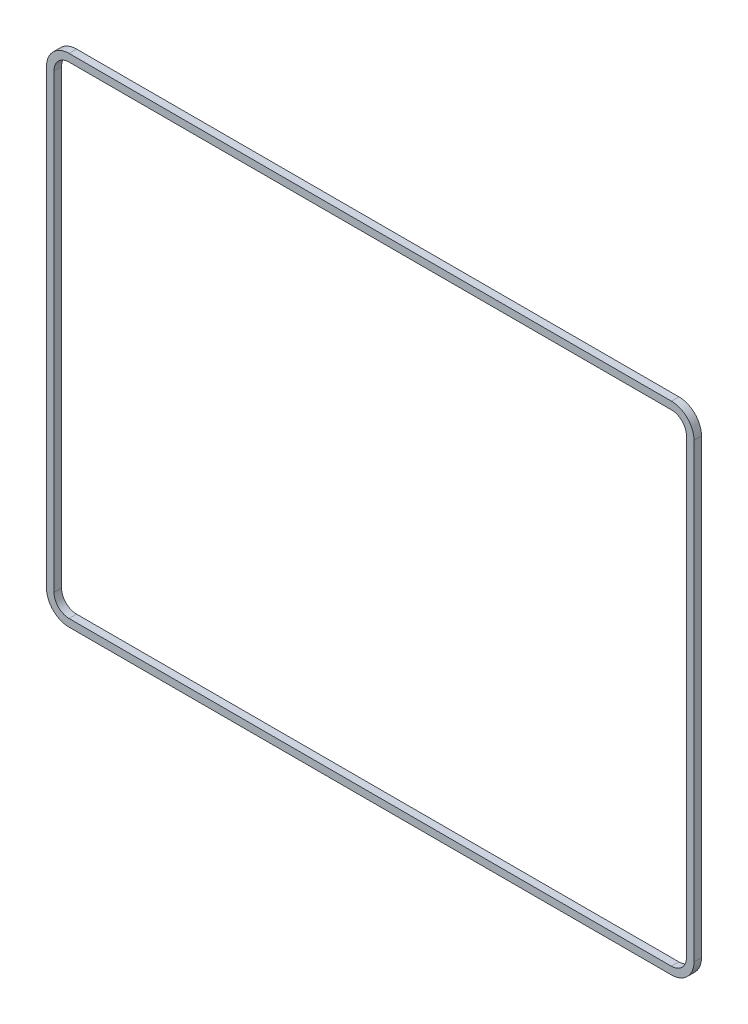
ISO-10303-21;
HEADER;
FILE_DESCRIPTION(('STEP AP214'),'2;1');
FILE_NAME('part.step','',(''),(''),'','','');
FILE_SCHEMA(('AUTOMOTIVE_DESIGN { 1 0 10303 214 1 1 1 1 }'));
ENDSEC;
DATA;
#1=APPLICATION_CONTEXT('core data for automotive mechanical design processes');
#2=APPLICATION_PROTOCOL_DEFINITION('international standard','automotive_design',2000,#1);
#3=PRODUCT_CONTEXT('',#1,'mechanical');
#4=PRODUCT('Part','Part','',(#3));
#5=PRODUCT_RELATED_PRODUCT_CATEGORY('part','',(#4));
#6=PRODUCT_DEFINITION_FORMATION('','',#4);
#7=PRODUCT_DEFINITION_CONTEXT('part definition',#1,'design');
#8=PRODUCT_DEFINITION('design','',#6,#7);
#9=PRODUCT_DEFINITION_SHAPE('','',#8);
#10=(LENGTH_UNIT() NAMED_UNIT(*) SI_UNIT(.MILLI.,.METRE.));
#11=(NAMED_UNIT(*) PLANE_ANGLE_UNIT() SI_UNIT($,.RADIAN.));
#12=(NAMED_UNIT(*) SI_UNIT($,.STERADIAN.) SOLID_ANGLE_UNIT());
#13=UNCERTAINTY_MEASURE_WITH_UNIT(LENGTH_MEASURE(1.E-05),#10,'distance_accuracy_value','');
#14=(GEOMETRIC_REPRESENTATION_CONTEXT(3) GLOBAL_UNCERTAINTY_ASSIGNED_CONTEXT((#13)) GLOBAL_UNIT_ASSIGNED_CONTEXT((#10,
#11,#12)) REPRESENTATION_CONTEXT('',''));
#15=CARTESIAN_POINT('',(0.,0.,0.));
#16=DIRECTION('',(0.,0.,1.));
#17=DIRECTION('',(1.,0.,0.));
#18=AXIS2_PLACEMENT_3D('',#15,#16,#17);
#19=CARTESIAN_POINT('',(0.,0.,0.));
#20=DIRECTION('',(0.,0.,-1.));
#21=DIRECTION('',(-1.,0.,0.));
#22=AXIS2_PLACEMENT_3D('',#19,#20,#21);
#23=PLANE('',#22);
#24=DIRECTION('',(1.,0.,0.));
#25=VECTOR('',#24,1.);
#26=CARTESIAN_POINT('',(639.673702112464,-1480.08252894504,0.));
#27=LINE('',#26,#25);
#28=CARTESIAN_POINT('',(639.673702112464,-1480.08252894504,0.));
#29=VERTEX_POINT('',#28);
#30=CARTESIAN_POINT('',(842.873702112464,-1480.08252894504,0.));
#31=VERTEX_POINT('',#30);
#32=EDGE_CURVE('E222',#29,#31,#27,.T.);
#33=ORIENTED_EDGE('',*,*,#32,.T.);
#34=CARTESIAN_POINT('',(842.873702112464,-1472.46252894504,0.));
#35=DIRECTION('',(0.,0.,1.));
#36=DIRECTION('',(1.,0.,0.));
#37=AXIS2_PLACEMENT_3D('',#34,#35,#36);
#38=CIRCLE('',#37,7.62000000000002);
#39=CARTESIAN_POINT('',(850.493702112464,-1472.46252894504,0.));
#40=VERTEX_POINT('',#39);
#41=EDGE_CURVE('E11',#31,#40,#38,.T.);
#42=ORIENTED_EDGE('',*,*,#41,.T.);
#43=DIRECTION('',(0.,1.,0.));
#44=VECTOR('',#43,1.);
#45=CARTESIAN_POINT('',(850.493702112464,-1472.46252894504,0.));
#46=LINE('',#45,#44);
#47=CARTESIAN_POINT('',(850.493702112464,-1320.06252894504,0.));
#48=VERTEX_POINT('',#47);
#49=EDGE_CURVE('E46',#40,#48,#46,.T.);
#50=ORIENTED_EDGE('',*,*,#49,.T.);
#51=CARTESIAN_POINT('',(842.873702112464,-1320.06252894504,0.));
#52=DIRECTION('',(0.,0.,1.));
#53=DIRECTION('',(1.,0.,0.));
#54=AXIS2_PLACEMENT_3D('',#51,#52,#53);
#55=CIRCLE('',#54,7.62000000000002);
#56=CARTESIAN_POINT('',(842.873702112464,-1312.44252894504,0.));
#57=VERTEX_POINT('',#56);
#58=EDGE_CURVE('E208',#48,#57,#55,.T.);
#59=ORIENTED_EDGE('',*,*,#58,.T.);
#60=DIRECTION('',(-1.,0.,0.));
#61=VECTOR('',#60,1.);
#62=CARTESIAN_POINT('',(842.873702112464,-1312.44252894504,0.));
#63=LINE('',#62,#61);
#64=CARTESIAN_POINT('',(639.673702112464,-1312.44252894504,0.));
#65=VERTEX_POINT('',#64);
#66=EDGE_CURVE('E211',#57,#65,#63,.T.);
#67=ORIENTED_EDGE('',*,*,#66,.T.);
#68=CARTESIAN_POINT('',(639.673702112464,-1320.06252894504,0.));
#69=DIRECTION('',(0.,0.,1.));
#70=DIRECTION('',(1.,0.,0.));
#71=AXIS2_PLACEMENT_3D('',#68,#69,#70);
#72=CIRCLE('',#71,7.62000000000002);
#73=CARTESIAN_POINT('',(632.053702112464,-1320.06252894504,0.));
#74=VERTEX_POINT('',#73);
#75=EDGE_CURVE('E214',#65,#74,#72,.T.);
#76=ORIENTED_EDGE('',*,*,#75,.T.);
#77=DIRECTION('',(0.,-1.,0.));
#78=VECTOR('',#77,1.);
#79=CARTESIAN_POINT('',(632.053702112464,-1320.06252894504,0.));
#80=LINE('',#79,#78);
#81=CARTESIAN_POINT('',(632.053702112464,-1472.46252894504,0.));
#82=VERTEX_POINT('',#81);
#83=EDGE_CURVE('E217',#74,#82,#80,.T.);
#84=ORIENTED_EDGE('',*,*,#83,.T.);
#85=CARTESIAN_POINT('',(639.673702112464,-1472.46252894504,0.));
#86=DIRECTION('',(0.,0.,1.));
#87=DIRECTION('',(1.,0.,0.));
#88=AXIS2_PLACEMENT_3D('',#85,#86,#87);
#89=CIRCLE('',#88,7.62000000000002);
#90=EDGE_CURVE('E220',#82,#29,#89,.T.);
#91=ORIENTED_EDGE('',*,*,#90,.T.);
#92=EDGE_LOOP('',(#33,#42,#50,#59,#67,#76,#84,#91));
#93=FACE_BOUND('',#92,.T.);
#94=DIRECTION('',(1.,0.,0.));
#95=VECTOR('',#94,1.);
#96=CARTESIAN_POINT('',(639.673702112464,-1477.54252894504,0.));
#97=LINE('',#96,#95);
#98=CARTESIAN_POINT('',(639.673702112464,-1477.54252894504,0.));
#99=VERTEX_POINT('',#98);
#100=CARTESIAN_POINT('',(842.873702112464,-1477.54252894504,0.));
#101=VERTEX_POINT('',#100);
#102=EDGE_CURVE('E323',#99,#101,#97,.T.);
#103=ORIENTED_EDGE('',*,*,#102,.F.);
#104=CARTESIAN_POINT('',(639.673702112464,-1472.46252894504,0.));
#105=DIRECTION('',(0.,0.,1.));
#106=DIRECTION('',(1.,0.,0.));
#107=AXIS2_PLACEMENT_3D('',#104,#105,#106);
#108=CIRCLE('',#107,5.08000000000003);
#109=CARTESIAN_POINT('',(634.593702112464,-1472.46252894504,0.));
#110=VERTEX_POINT('',#109);
#111=EDGE_CURVE('E328',#110,#99,#108,.T.);
#112=ORIENTED_EDGE('',*,*,#111,.F.);
#113=DIRECTION('',(0.,-1.,0.));
#114=VECTOR('',#113,1.);
#115=CARTESIAN_POINT('',(634.593702112464,-1320.06252894504,0.));
#116=LINE('',#115,#114);
#117=CARTESIAN_POINT('',(634.593702112464,-1320.06252894504,0.));
#118=VERTEX_POINT('',#117);
#119=EDGE_CURVE('E331',#118,#110,#116,.T.);
#120=ORIENTED_EDGE('',*,*,#119,.F.);
#121=CARTESIAN_POINT('',(639.673702112464,-1320.06252894504,0.));
#122=DIRECTION('',(0.,0.,1.));
#123=DIRECTION('',(1.,0.,0.));
#124=AXIS2_PLACEMENT_3D('',#121,#122,#123);
#125=CIRCLE('',#124,5.07999999999997);
#126=CARTESIAN_POINT('',(639.673702112464,-1314.98252894504,0.));
#127=VERTEX_POINT('',#126);
#128=EDGE_CURVE('E355',#127,#118,#125,.T.);
#129=ORIENTED_EDGE('',*,*,#128,.F.);
#130=DIRECTION('',(-1.,0.,0.));
#131=VECTOR('',#130,1.);
#132=CARTESIAN_POINT('',(842.873702112464,-1314.98252894504,0.));
#133=LINE('',#132,#131);
#134=CARTESIAN_POINT('',(842.873702112464,-1314.98252894504,0.));
#135=VERTEX_POINT('',#134);
#136=EDGE_CURVE('E347',#135,#127,#133,.T.);
#137=ORIENTED_EDGE('',*,*,#136,.F.);
#138=CARTESIAN_POINT('',(842.873702112464,-1320.06252894504,0.));
#139=DIRECTION('',(0.,0.,1.));
#140=DIRECTION('',(1.,0.,0.));
#141=AXIS2_PLACEMENT_3D('',#138,#139,#140);
#142=CIRCLE('',#141,5.08000000000003);
#143=CARTESIAN_POINT('',(847.953702112464,-1320.06252894504,0.));
#144=VERTEX_POINT('',#143);
#145=EDGE_CURVE('E164',#144,#135,#142,.T.);
#146=ORIENTED_EDGE('',*,*,#145,.F.);
#147=DIRECTION('',(0.,1.,0.));
#148=VECTOR('',#147,1.);
#149=CARTESIAN_POINT('',(847.953702112464,-1472.46252894504,0.));
#150=LINE('',#149,#148);
#151=CARTESIAN_POINT('',(847.953702112464,-1472.46252894504,0.));
#152=VERTEX_POINT('',#151);
#153=EDGE_CURVE('E160',#152,#144,#150,.T.);
#154=ORIENTED_EDGE('',*,*,#153,.F.);
#155=CARTESIAN_POINT('',(842.873702112464,-1472.46252894504,0.));
#156=DIRECTION('',(0.,0.,1.));
#157=DIRECTION('',(1.,0.,0.));
#158=AXIS2_PLACEMENT_3D('',#155,#156,#157);
#159=CIRCLE('',#158,5.07999999999997);
#160=EDGE_CURVE('E149',#101,#152,#159,.T.);
#161=ORIENTED_EDGE('',*,*,#160,.F.);
#162=EDGE_LOOP('',(#103,#112,#120,#129,#137,#146,#154,#161));
#163=FACE_BOUND('',#162,.T.);
#164=ADVANCED_FACE('F38',(#93,#163),#23,.F.);
#165=CARTESIAN_POINT('',(842.873702112464,-1472.46252894504,-2.54));
#166=DIRECTION('',(0.,0.,1.));
#167=DIRECTION('',(1.,0.,0.));
#168=AXIS2_PLACEMENT_3D('',#165,#166,#167);
#169=CYLINDRICAL_SURFACE('',#168,7.62000000000002);
#170=ORIENTED_EDGE('',*,*,#41,.F.);
#171=DIRECTION('',(0.,0.,1.));
#172=VECTOR('',#171,1.);
#173=CARTESIAN_POINT('',(842.873702112464,-1480.08252894504,-2.54));
#174=LINE('',#173,#172);
#175=CARTESIAN_POINT('',(842.873702112464,-1480.08252894504,-2.54));
#176=VERTEX_POINT('',#175);
#177=EDGE_CURVE('E224',#176,#31,#174,.T.);
#178=ORIENTED_EDGE('',*,*,#177,.F.);
#179=CARTESIAN_POINT('',(842.873702112464,-1472.46252894504,-2.54));
#180=DIRECTION('',(0.,0.,1.));
#181=DIRECTION('',(1.,0.,0.));
#182=AXIS2_PLACEMENT_3D('',#179,#180,#181);
#183=CIRCLE('',#182,7.62000000000002);
#184=CARTESIAN_POINT('',(850.493702112464,-1472.46252894504,-2.54));
#185=VERTEX_POINT('',#184);
#186=EDGE_CURVE('E183',#176,#185,#183,.T.);
#187=ORIENTED_EDGE('',*,*,#186,.T.);
#188=DIRECTION('',(0.,0.,1.));
#189=VECTOR('',#188,1.);
#190=CARTESIAN_POINT('',(850.493702112464,-1472.46252894504,-2.54));
#191=LINE('',#190,#189);
#192=EDGE_CURVE('E41',#185,#40,#191,.T.);
#193=ORIENTED_EDGE('',*,*,#192,.T.);
#194=EDGE_LOOP('',(#170,#178,#187,#193));
#195=FACE_BOUND('',#194,.T.);
#196=ADVANCED_FACE('F242',(#195),#169,.T.);
#197=CARTESIAN_POINT('',(850.493702112464,-1472.46252894504,-2.54));
#198=DIRECTION('',(1.,0.,0.));
#199=DIRECTION('',(0.,0.,-1.));
#200=AXIS2_PLACEMENT_3D('',#197,#198,#199);
#201=PLANE('',#200);
#202=ORIENTED_EDGE('',*,*,#49,.F.);
#203=ORIENTED_EDGE('',*,*,#192,.F.);
#204=DIRECTION('',(0.,1.,0.));
#205=VECTOR('',#204,1.);
#206=CARTESIAN_POINT('',(850.493702112464,-1472.46252894504,-2.54));
#207=LINE('',#206,#205);
#208=CARTESIAN_POINT('',(850.493702112464,-1320.06252894504,-2.54));
#209=VERTEX_POINT('',#208);
#210=EDGE_CURVE('E186',#185,#209,#207,.T.);
#211=ORIENTED_EDGE('',*,*,#210,.T.);
#212=DIRECTION('',(0.,0.,1.));
#213=VECTOR('',#212,1.);
#214=CARTESIAN_POINT('',(850.493702112464,-1320.06252894504,-2.54));
#215=LINE('',#214,#213);
#216=EDGE_CURVE('E241',#209,#48,#215,.T.);
#217=ORIENTED_EDGE('',*,*,#216,.T.);
#218=EDGE_LOOP('',(#202,#203,#211,#217));
#219=FACE_BOUND('',#218,.T.);
#220=ADVANCED_FACE('F245',(#219),#201,.T.);
#221=CARTESIAN_POINT('',(842.873702112464,-1320.06252894504,-2.54));
#222=DIRECTION('',(0.,0.,1.));
#223=DIRECTION('',(1.,0.,0.));
#224=AXIS2_PLACEMENT_3D('',#221,#222,#223);
#225=CYLINDRICAL_SURFACE('',#224,7.62000000000002);
#226=ORIENTED_EDGE('',*,*,#58,.F.);
#227=ORIENTED_EDGE('',*,*,#216,.F.);
#228=CARTESIAN_POINT('',(842.873702112464,-1320.06252894504,-2.54));
#229=DIRECTION('',(0.,0.,1.));
#230=DIRECTION('',(1.,0.,0.));
#231=AXIS2_PLACEMENT_3D('',#228,#229,#230);
#232=CIRCLE('',#231,7.62000000000002);
#233=CARTESIAN_POINT('',(842.873702112464,-1312.44252894504,-2.54));
#234=VERTEX_POINT('',#233);
#235=EDGE_CURVE('E189',#209,#234,#232,.T.);
#236=ORIENTED_EDGE('',*,*,#235,.T.);
#237=DIRECTION('',(0.,0.,1.));
#238=VECTOR('',#237,1.);
#239=CARTESIAN_POINT('',(842.873702112464,-1312.44252894504,-2.54));
#240=LINE('',#239,#238);
#241=EDGE_CURVE('E239',#234,#57,#240,.T.);
#242=ORIENTED_EDGE('',*,*,#241,.T.);
#243=EDGE_LOOP('',(#226,#227,#236,#242));
#244=FACE_BOUND('',#243,.T.);
#245=ADVANCED_FACE('F253',(#244),#225,.T.);
#246=CARTESIAN_POINT('',(842.873702112464,-1312.44252894504,-2.54));
#247=DIRECTION('',(0.,1.,0.));
#248=DIRECTION('',(0.,0.,1.));
#249=AXIS2_PLACEMENT_3D('',#246,#247,#248);
#250=PLANE('',#249);
#251=ORIENTED_EDGE('',*,*,#66,.F.);
#252=ORIENTED_EDGE('',*,*,#241,.F.);
#253=DIRECTION('',(-1.,0.,0.));
#254=VECTOR('',#253,1.);
#255=CARTESIAN_POINT('',(842.873702112464,-1312.44252894504,-2.54));
#256=LINE('',#255,#254);
#257=CARTESIAN_POINT('',(639.673702112464,-1312.44252894504,-2.54));
#258=VERTEX_POINT('',#257);
#259=EDGE_CURVE('E192',#234,#258,#256,.T.);
#260=ORIENTED_EDGE('',*,*,#259,.T.);
#261=DIRECTION('',(0.,0.,1.));
#262=VECTOR('',#261,1.);
#263=CARTESIAN_POINT('',(639.673702112464,-1312.44252894504,-2.54));
#264=LINE('',#263,#262);
#265=EDGE_CURVE('E236',#258,#65,#264,.T.);
#266=ORIENTED_EDGE('',*,*,#265,.T.);
#267=EDGE_LOOP('',(#251,#252,#260,#266));
#268=FACE_BOUND('',#267,.T.);
#269=ADVANCED_FACE('F266',(#268),#250,.T.);
#270=CARTESIAN_POINT('',(639.673702112464,-1320.06252894504,-2.54));
#271=DIRECTION('',(0.,0.,1.));
#272=DIRECTION('',(1.,0.,0.));
#273=AXIS2_PLACEMENT_3D('',#270,#271,#272);
#274=CYLINDRICAL_SURFACE('',#273,7.62000000000002);
#275=ORIENTED_EDGE('',*,*,#75,.F.);
#276=ORIENTED_EDGE('',*,*,#265,.F.);
#277=CARTESIAN_POINT('',(639.673702112464,-1320.06252894504,-2.54));
#278=DIRECTION('',(0.,0.,1.));
#279=DIRECTION('',(1.,0.,0.));
#280=AXIS2_PLACEMENT_3D('',#277,#278,#279);
#281=CIRCLE('',#280,7.62000000000002);
#282=CARTESIAN_POINT('',(632.053702112464,-1320.06252894504,-2.54));
#283=VERTEX_POINT('',#282);
#284=EDGE_CURVE('E195',#258,#283,#281,.T.);
#285=ORIENTED_EDGE('',*,*,#284,.T.);
#286=DIRECTION('',(0.,0.,1.));
#287=VECTOR('',#286,1.);
#288=CARTESIAN_POINT('',(632.053702112464,-1320.06252894504,-2.54));
#289=LINE('',#288,#287);
#290=EDGE_CURVE('E233',#283,#74,#289,.T.);
#291=ORIENTED_EDGE('',*,*,#290,.T.);
#292=EDGE_LOOP('',(#275,#276,#285,#291));
#293=FACE_BOUND('',#292,.T.);
#294=ADVANCED_FACE('F264',(#293),#274,.T.);
#295=CARTESIAN_POINT('',(639.673702112464,-1480.08252894504,-2.54));
#296=DIRECTION('',(0.,-1.,0.));
#297=DIRECTION('',(0.,0.,-1.));
#298=AXIS2_PLACEMENT_3D('',#295,#296,#297);
#299=PLANE('',#298);
#300=ORIENTED_EDGE('',*,*,#32,.F.);
#301=DIRECTION('',(0.,0.,1.));
#302=VECTOR('',#301,1.);
#303=CARTESIAN_POINT('',(639.673702112464,-1480.08252894504,-2.54));
#304=LINE('',#303,#302);
#305=CARTESIAN_POINT('',(639.673702112464,-1480.08252894504,-2.54));
#306=VERTEX_POINT('',#305);
#307=EDGE_CURVE('E227',#306,#29,#304,.T.);
#308=ORIENTED_EDGE('',*,*,#307,.F.);
#309=DIRECTION('',(1.,0.,0.));
#310=VECTOR('',#309,1.);
#311=CARTESIAN_POINT('',(639.673702112464,-1480.08252894504,-2.54));
#312=LINE('',#311,#310);
#313=EDGE_CURVE('E204',#306,#176,#312,.T.);
#314=ORIENTED_EDGE('',*,*,#313,.T.);
#315=ORIENTED_EDGE('',*,*,#177,.T.);
#316=EDGE_LOOP('',(#300,#308,#314,#315));
#317=FACE_BOUND('',#316,.T.);
#318=ADVANCED_FACE('F257',(#317),#299,.T.);
#319=CARTESIAN_POINT('',(639.673702112464,-1477.54252894504,-2.54));
#320=DIRECTION('',(0.,-1.,0.));
#321=DIRECTION('',(0.,0.,-1.));
#322=AXIS2_PLACEMENT_3D('',#319,#320,#321);
#323=PLANE('',#322);
#324=ORIENTED_EDGE('',*,*,#102,.T.);
#325=DIRECTION('',(0.,0.,1.));
#326=VECTOR('',#325,1.);
#327=CARTESIAN_POINT('',(842.873702112464,-1477.54252894504,-2.54));
#328=LINE('',#327,#326);
#329=CARTESIAN_POINT('',(842.873702112464,-1477.54252894504,-2.54));
#330=VERTEX_POINT('',#329);
#331=EDGE_CURVE('E156',#330,#101,#328,.T.);
#332=ORIENTED_EDGE('',*,*,#331,.F.);
#333=DIRECTION('',(1.,0.,0.));
#334=VECTOR('',#333,1.);
#335=CARTESIAN_POINT('',(639.673702112464,-1477.54252894504,-2.54));
#336=LINE('',#335,#334);
#337=CARTESIAN_POINT('',(639.673702112464,-1477.54252894504,-2.54));
#338=VERTEX_POINT('',#337);
#339=EDGE_CURVE('E174',#338,#330,#336,.T.);
#340=ORIENTED_EDGE('',*,*,#339,.F.);
#341=DIRECTION('',(0.,0.,1.));
#342=VECTOR('',#341,1.);
#343=CARTESIAN_POINT('',(639.673702112464,-1477.54252894504,-2.54));
#344=LINE('',#343,#342);
#345=EDGE_CURVE('E325',#338,#99,#344,.T.);
#346=ORIENTED_EDGE('',*,*,#345,.T.);
#347=EDGE_LOOP('',(#324,#332,#340,#346));
#348=FACE_BOUND('',#347,.T.);
#349=ADVANCED_FACE('F290',(#348),#323,.F.);
#350=CARTESIAN_POINT('',(639.673702112464,-1472.46252894504,-2.54));
#351=DIRECTION('',(0.,0.,1.));
#352=DIRECTION('',(1.,0.,0.));
#353=AXIS2_PLACEMENT_3D('',#350,#351,#352);
#354=CYLINDRICAL_SURFACE('',#353,5.08000000000003);
#355=ORIENTED_EDGE('',*,*,#111,.T.);
#356=ORIENTED_EDGE('',*,*,#345,.F.);
#357=CARTESIAN_POINT('',(639.673702112464,-1472.46252894504,-2.54));
#358=DIRECTION('',(0.,0.,1.));
#359=DIRECTION('',(1.,0.,0.));
#360=AXIS2_PLACEMENT_3D('',#357,#358,#359);
#361=CIRCLE('',#360,5.08000000000003);
#362=CARTESIAN_POINT('',(634.593702112464,-1472.46252894504,-2.54));
#363=VERTEX_POINT('',#362);
#364=EDGE_CURVE('E179',#363,#338,#361,.T.);
#365=ORIENTED_EDGE('',*,*,#364,.F.);
#366=DIRECTION('',(0.,0.,1.));
#367=VECTOR('',#366,1.);
#368=CARTESIAN_POINT('',(634.593702112464,-1472.46252894504,-2.54));
#369=LINE('',#368,#367);
#370=EDGE_CURVE('E337',#363,#110,#369,.T.);
#371=ORIENTED_EDGE('',*,*,#370,.T.);
#372=EDGE_LOOP('',(#355,#356,#365,#371));
#373=FACE_BOUND('',#372,.T.);
#374=ADVANCED_FACE('F313',(#373),#354,.F.);
#375=CARTESIAN_POINT('',(634.593702112464,-1320.06252894504,-2.54));
#376=DIRECTION('',(-1.,0.,0.));
#377=DIRECTION('',(0.,-1.,0.));
#378=AXIS2_PLACEMENT_3D('',#375,#376,#377);
#379=PLANE('',#378);
#380=ORIENTED_EDGE('',*,*,#119,.T.);
#381=ORIENTED_EDGE('',*,*,#370,.F.);
#382=DIRECTION('',(0.,-1.,0.));
#383=VECTOR('',#382,1.);
#384=CARTESIAN_POINT('',(634.593702112464,-1320.06252894504,-2.54));
#385=LINE('',#384,#383);
#386=CARTESIAN_POINT('',(634.593702112464,-1320.06252894504,-2.54));
#387=VERTEX_POINT('',#386);
#388=EDGE_CURVE('E362',#387,#363,#385,.T.);
#389=ORIENTED_EDGE('',*,*,#388,.F.);
#390=DIRECTION('',(0.,0.,1.));
#391=VECTOR('',#390,1.);
#392=CARTESIAN_POINT('',(634.593702112464,-1320.06252894504,-2.54));
#393=LINE('',#392,#391);
#394=EDGE_CURVE('E340',#387,#118,#393,.T.);
#395=ORIENTED_EDGE('',*,*,#394,.T.);
#396=EDGE_LOOP('',(#380,#381,#389,#395));
#397=FACE_BOUND('',#396,.T.);
#398=ADVANCED_FACE('F309',(#397),#379,.F.);
#399=CARTESIAN_POINT('',(639.673702112464,-1320.06252894504,-2.54));
#400=DIRECTION('',(0.,0.,1.));
#401=DIRECTION('',(1.,0.,0.));
#402=AXIS2_PLACEMENT_3D('',#399,#400,#401);
#403=CYLINDRICAL_SURFACE('',#402,5.07999999999997);
#404=ORIENTED_EDGE('',*,*,#128,.T.);
#405=ORIENTED_EDGE('',*,*,#394,.F.);
#406=CARTESIAN_POINT('',(639.673702112464,-1320.06252894504,-2.54));
#407=DIRECTION('',(0.,0.,1.));
#408=DIRECTION('',(1.,0.,0.));
#409=AXIS2_PLACEMENT_3D('',#406,#407,#408);
#410=CIRCLE('',#409,5.07999999999997);
#411=CARTESIAN_POINT('',(639.673702112464,-1314.98252894504,-2.54));
#412=VERTEX_POINT('',#411);
#413=EDGE_CURVE('E366',#412,#387,#410,.T.);
#414=ORIENTED_EDGE('',*,*,#413,.F.);
#415=DIRECTION('',(0.,0.,1.));
#416=VECTOR('',#415,1.);
#417=CARTESIAN_POINT('',(639.673702112464,-1314.98252894504,-2.54));
#418=LINE('',#417,#416);
#419=EDGE_CURVE('E343',#412,#127,#418,.T.);
#420=ORIENTED_EDGE('',*,*,#419,.T.);
#421=EDGE_LOOP('',(#404,#405,#414,#420));
#422=FACE_BOUND('',#421,.T.);
#423=ADVANCED_FACE('F305',(#422),#403,.F.);
#424=CARTESIAN_POINT('',(842.873702112464,-1314.98252894504,-2.54));
#425=DIRECTION('',(0.,1.,0.));
#426=DIRECTION('',(0.,0.,1.));
#427=AXIS2_PLACEMENT_3D('',#424,#425,#426);
#428=PLANE('',#427);
#429=ORIENTED_EDGE('',*,*,#136,.T.);
#430=ORIENTED_EDGE('',*,*,#419,.F.);
#431=DIRECTION('',(-1.,0.,0.));
#432=VECTOR('',#431,1.);
#433=CARTESIAN_POINT('',(842.873702112464,-1314.98252894504,-2.54));
#434=LINE('',#433,#432);
#435=CARTESIAN_POINT('',(842.873702112464,-1314.98252894504,-2.54));
#436=VERTEX_POINT('',#435);
#437=EDGE_CURVE('E350',#436,#412,#434,.T.);
#438=ORIENTED_EDGE('',*,*,#437,.F.);
#439=DIRECTION('',(0.,0.,1.));
#440=VECTOR('',#439,1.);
#441=CARTESIAN_POINT('',(842.873702112464,-1314.98252894504,-2.54));
#442=LINE('',#441,#440);
#443=EDGE_CURVE('E176',#436,#135,#442,.T.);
#444=ORIENTED_EDGE('',*,*,#443,.T.);
#445=EDGE_LOOP('',(#429,#430,#438,#444));
#446=FACE_BOUND('',#445,.T.);
#447=ADVANCED_FACE('F297',(#446),#428,.F.);
#448=CARTESIAN_POINT('',(842.873702112464,-1472.46252894504,-2.54));
#449=DIRECTION('',(0.,0.,1.));
#450=DIRECTION('',(1.,0.,0.));
#451=AXIS2_PLACEMENT_3D('',#448,#449,#450);
#452=CYLINDRICAL_SURFACE('',#451,5.07999999999997);
#453=ORIENTED_EDGE('',*,*,#160,.T.);
#454=DIRECTION('',(0.,0.,1.));
#455=VECTOR('',#454,1.);
#456=CARTESIAN_POINT('',(847.953702112464,-1472.46252894504,-2.54));
#457=LINE('',#456,#455);
#458=CARTESIAN_POINT('',(847.953702112464,-1472.46252894504,-2.54));
#459=VERTEX_POINT('',#458);
#460=EDGE_CURVE('E154',#459,#152,#457,.T.);
#461=ORIENTED_EDGE('',*,*,#460,.F.);
#462=CARTESIAN_POINT('',(842.873702112464,-1472.46252894504,-2.54));
#463=DIRECTION('',(0.,0.,1.));
#464=DIRECTION('',(1.,0.,0.));
#465=AXIS2_PLACEMENT_3D('',#462,#463,#464);
#466=CIRCLE('',#465,5.07999999999997);
#467=EDGE_CURVE('E327',#330,#459,#466,.T.);
#468=ORIENTED_EDGE('',*,*,#467,.F.);
#469=ORIENTED_EDGE('',*,*,#331,.T.);
#470=EDGE_LOOP('',(#453,#461,#468,#469));
#471=FACE_BOUND('',#470,.T.);
#472=ADVANCED_FACE('F151',(#471),#452,.F.);
#473=CARTESIAN_POINT('',(842.873702112464,-1472.46252894504,-2.54));
#474=DIRECTION('',(0.,0.,1.));
#475=DIRECTION('',(1.,0.,0.));
#476=AXIS2_PLACEMENT_3D('',#473,#474,#475);
#477=PLANE('',#476);
#478=ORIENTED_EDGE('',*,*,#339,.T.);
#479=ORIENTED_EDGE('',*,*,#467,.T.);
#480=DIRECTION('',(0.,1.,0.));
#481=VECTOR('',#480,1.);
#482=CARTESIAN_POINT('',(847.953702112464,-1472.46252894504,-2.54));
#483=LINE('',#482,#481);
#484=CARTESIAN_POINT('',(847.953702112464,-1320.06252894504,-2.54));
#485=VERTEX_POINT('',#484);
#486=EDGE_CURVE('E171',#459,#485,#483,.T.);
#487=ORIENTED_EDGE('',*,*,#486,.T.);
#488=CARTESIAN_POINT('',(842.873702112464,-1320.06252894504,-2.54));
#489=DIRECTION('',(0.,0.,1.));
#490=DIRECTION('',(1.,0.,0.));
#491=AXIS2_PLACEMENT_3D('',#488,#489,#490);
#492=CIRCLE('',#491,5.08000000000003);
#493=EDGE_CURVE('E352',#485,#436,#492,.T.);
#494=ORIENTED_EDGE('',*,*,#493,.T.);
#495=ORIENTED_EDGE('',*,*,#437,.T.);
#496=ORIENTED_EDGE('',*,*,#413,.T.);
#497=ORIENTED_EDGE('',*,*,#388,.T.);
#498=ORIENTED_EDGE('',*,*,#364,.T.);
#499=EDGE_LOOP('',(#478,#479,#487,#494,#495,#496,#497,#498));
#500=FACE_BOUND('',#499,.T.);
#501=ORIENTED_EDGE('',*,*,#186,.F.);
#502=ORIENTED_EDGE('',*,*,#313,.F.);
#503=CARTESIAN_POINT('',(639.673702112464,-1472.46252894504,-2.54));
#504=DIRECTION('',(0.,0.,1.));
#505=DIRECTION('',(1.,0.,0.));
#506=AXIS2_PLACEMENT_3D('',#503,#504,#505);
#507=CIRCLE('',#506,7.62000000000002);
#508=CARTESIAN_POINT('',(632.053702112464,-1472.46252894504,-2.54));
#509=VERTEX_POINT('',#508);
#510=EDGE_CURVE('E201',#509,#306,#507,.T.);
#511=ORIENTED_EDGE('',*,*,#510,.F.);
#512=DIRECTION('',(0.,-1.,0.));
#513=VECTOR('',#512,1.);
#514=CARTESIAN_POINT('',(632.053702112464,-1320.06252894504,-2.54));
#515=LINE('',#514,#513);
#516=EDGE_CURVE('E198',#283,#509,#515,.T.);
#517=ORIENTED_EDGE('',*,*,#516,.F.);
#518=ORIENTED_EDGE('',*,*,#284,.F.);
#519=ORIENTED_EDGE('',*,*,#259,.F.);
#520=ORIENTED_EDGE('',*,*,#235,.F.);
#521=ORIENTED_EDGE('',*,*,#210,.F.);
#522=EDGE_LOOP('',(#501,#502,#511,#517,#518,#519,#520,#521));
#523=FACE_BOUND('',#522,.T.);
#524=ADVANCED_FACE('F248',(#500,#523),#477,.F.);
#525=CARTESIAN_POINT('',(842.873702112464,-1320.06252894504,-2.54));
#526=DIRECTION('',(0.,0.,1.));
#527=DIRECTION('',(1.,0.,0.));
#528=AXIS2_PLACEMENT_3D('',#525,#526,#527);
#529=CYLINDRICAL_SURFACE('',#528,5.08000000000003);
#530=ORIENTED_EDGE('',*,*,#145,.T.);
#531=ORIENTED_EDGE('',*,*,#443,.F.);
#532=ORIENTED_EDGE('',*,*,#493,.F.);
#533=DIRECTION('',(0.,0.,1.));
#534=VECTOR('',#533,1.);
#535=CARTESIAN_POINT('',(847.953702112464,-1320.06252894504,-2.54));
#536=LINE('',#535,#534);
#537=EDGE_CURVE('E173',#485,#144,#536,.T.);
#538=ORIENTED_EDGE('',*,*,#537,.T.);
#539=EDGE_LOOP('',(#530,#531,#532,#538));
#540=FACE_BOUND('',#539,.T.);
#541=ADVANCED_FACE('F293',(#540),#529,.F.);
#542=CARTESIAN_POINT('',(847.953702112464,-1472.46252894504,-2.54));
#543=DIRECTION('',(1.,0.,0.));
#544=DIRECTION('',(0.,1.,0.));
#545=AXIS2_PLACEMENT_3D('',#542,#543,#544);
#546=PLANE('',#545);
#547=ORIENTED_EDGE('',*,*,#153,.T.);
#548=ORIENTED_EDGE('',*,*,#537,.F.);
#549=ORIENTED_EDGE('',*,*,#486,.F.);
#550=ORIENTED_EDGE('',*,*,#460,.T.);
#551=EDGE_LOOP('',(#547,#548,#549,#550));
#552=FACE_BOUND('',#551,.T.);
#553=ADVANCED_FACE('F169',(#552),#546,.F.);
#554=CARTESIAN_POINT('',(632.053702112464,-1320.06252894504,-2.54));
#555=DIRECTION('',(-1.,0.,0.));
#556=DIRECTION('',(0.,0.,1.));
#557=AXIS2_PLACEMENT_3D('',#554,#555,#556);
#558=PLANE('',#557);
#559=ORIENTED_EDGE('',*,*,#83,.F.);
#560=ORIENTED_EDGE('',*,*,#290,.F.);
#561=ORIENTED_EDGE('',*,*,#516,.T.);
#562=DIRECTION('',(0.,0.,1.));
#563=VECTOR('',#562,1.);
#564=CARTESIAN_POINT('',(632.053702112464,-1472.46252894504,-2.54));
#565=LINE('',#564,#563);
#566=EDGE_CURVE('E230',#509,#82,#565,.T.);
#567=ORIENTED_EDGE('',*,*,#566,.T.);
#568=EDGE_LOOP('',(#559,#560,#561,#567));
#569=FACE_BOUND('',#568,.T.);
#570=ADVANCED_FACE('F262',(#569),#558,.T.);
#571=CARTESIAN_POINT('',(639.673702112464,-1472.46252894504,-2.54));
#572=DIRECTION('',(0.,0.,1.));
#573=DIRECTION('',(1.,0.,0.));
#574=AXIS2_PLACEMENT_3D('',#571,#572,#573);
#575=CYLINDRICAL_SURFACE('',#574,7.62000000000002);
#576=ORIENTED_EDGE('',*,*,#90,.F.);
#577=ORIENTED_EDGE('',*,*,#566,.F.);
#578=ORIENTED_EDGE('',*,*,#510,.T.);
#579=ORIENTED_EDGE('',*,*,#307,.T.);
#580=EDGE_LOOP('',(#576,#577,#578,#579));
#581=FACE_BOUND('',#580,.T.);
#582=ADVANCED_FACE('F276',(#581),#575,.T.);
#583=CLOSED_SHELL('',(#164,#196,#220,#245,#269,#294,#318,#349,#374,#398,#423,#447,#472,#524,
#541,#553,#570,#582));
#584=MANIFOLD_SOLID_BREP('B2',#583);
#585=ADVANCED_BREP_SHAPE_REPRESENTATION('',(#18,#584),#14);
#586=SHAPE_DEFINITION_REPRESENTATION(#9,#585);
ENDSEC;
END-ISO-10303-21;
